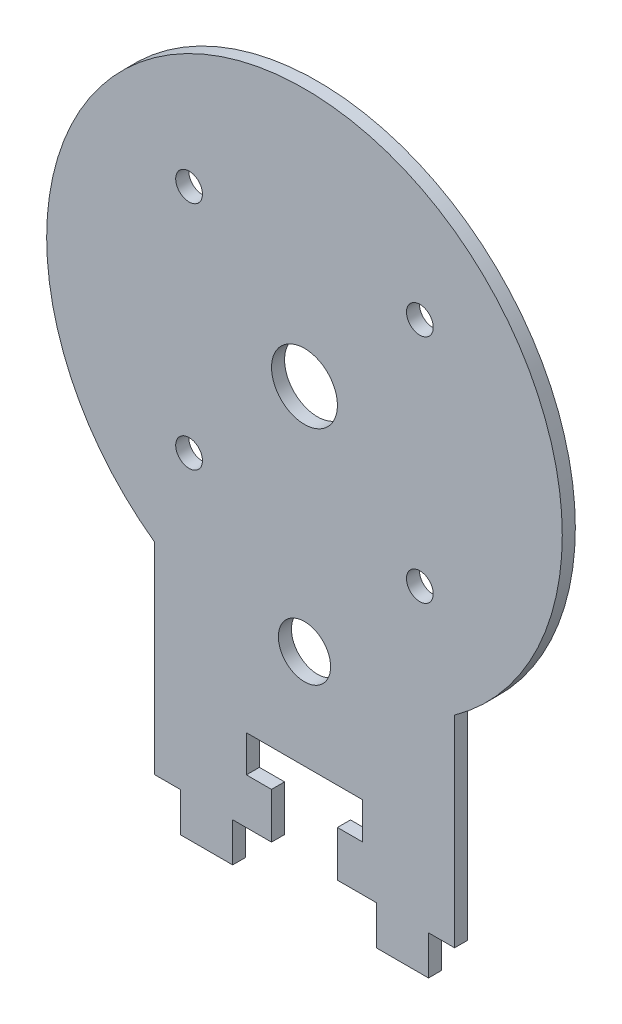
ISO-10303-21;
HEADER;
FILE_DESCRIPTION(('STEP AP214'),'2;1');
FILE_NAME('part.step','',(''),(''),'','','');
FILE_SCHEMA(('AUTOMOTIVE_DESIGN { 1 0 10303 214 1 1 1 1 }'));
ENDSEC;
DATA;
#1=APPLICATION_CONTEXT('core data for automotive mechanical design processes');
#2=APPLICATION_PROTOCOL_DEFINITION('international standard','automotive_design',2000,#1);
#3=PRODUCT_CONTEXT('',#1,'mechanical');
#4=PRODUCT('Part','Part','',(#3));
#5=PRODUCT_RELATED_PRODUCT_CATEGORY('part','',(#4));
#6=PRODUCT_DEFINITION_FORMATION('','',#4);
#7=PRODUCT_DEFINITION_CONTEXT('part definition',#1,'design');
#8=PRODUCT_DEFINITION('design','',#6,#7);
#9=PRODUCT_DEFINITION_SHAPE('','',#8);
#10=(LENGTH_UNIT() NAMED_UNIT(*) SI_UNIT(.MILLI.,.METRE.));
#11=(NAMED_UNIT(*) PLANE_ANGLE_UNIT() SI_UNIT($,.RADIAN.));
#12=(NAMED_UNIT(*) SI_UNIT($,.STERADIAN.) SOLID_ANGLE_UNIT());
#13=UNCERTAINTY_MEASURE_WITH_UNIT(LENGTH_MEASURE(1.E-05),#10,'distance_accuracy_value','');
#14=(GEOMETRIC_REPRESENTATION_CONTEXT(3) GLOBAL_UNCERTAINTY_ASSIGNED_CONTEXT((#13)) GLOBAL_UNIT_ASSIGNED_CONTEXT((#10,
#11,#12)) REPRESENTATION_CONTEXT('',''));
#15=CARTESIAN_POINT('',(0.,0.,0.));
#16=DIRECTION('',(0.,0.,1.));
#17=DIRECTION('',(1.,0.,0.));
#18=AXIS2_PLACEMENT_3D('',#15,#16,#17);
#19=CARTESIAN_POINT('',(-7.637732912881,83.7362785958988,2.));
#20=DIRECTION('',(0.,0.,-1.));
#21=DIRECTION('',(-1.,0.,0.));
#22=AXIS2_PLACEMENT_3D('',#19,#20,#21);
#23=PLANE('',#22);
#24=DIRECTION('',(1.,0.,0.));
#25=VECTOR('',#24,1.);
#26=CARTESIAN_POINT('',(-2.587732912881,20.7362785958988,2.));
#27=LINE('',#26,#25);
#28=CARTESIAN_POINT('',(-2.587732912881,20.7362785958988,2.));
#29=VERTEX_POINT('',#28);
#30=CARTESIAN_POINT('',(3.362267087119,20.7362785958988,2.));
#31=VERTEX_POINT('',#30);
#32=EDGE_CURVE('E244',#29,#31,#27,.T.);
#33=ORIENTED_EDGE('',*,*,#32,.T.);
#34=DIRECTION('',(0.,-1.,0.));
#35=VECTOR('',#34,1.);
#36=CARTESIAN_POINT('',(3.362267087119,20.7362785958988,2.));
#37=LINE('',#36,#35);
#38=CARTESIAN_POINT('',(3.362267087119,14.7362785958988,2.));
#39=VERTEX_POINT('',#38);
#40=EDGE_CURVE('E131',#31,#39,#37,.T.);
#41=ORIENTED_EDGE('',*,*,#40,.T.);
#42=DIRECTION('',(1.,0.,0.));
#43=VECTOR('',#42,1.);
#44=CARTESIAN_POINT('',(3.362267087119,14.7362785958988,2.));
#45=LINE('',#44,#43);
#46=CARTESIAN_POINT('',(11.362267087119,14.7362785958988,2.));
#47=VERTEX_POINT('',#46);
#48=EDGE_CURVE('E295',#39,#47,#45,.T.);
#49=ORIENTED_EDGE('',*,*,#48,.T.);
#50=DIRECTION('',(0.,1.,0.));
#51=VECTOR('',#50,1.);
#52=CARTESIAN_POINT('',(11.362267087119,14.7362785958988,2.));
#53=LINE('',#52,#51);
#54=CARTESIAN_POINT('',(11.362267087119,20.7362785958988,2.));
#55=VERTEX_POINT('',#54);
#56=EDGE_CURVE('E314',#47,#55,#53,.T.);
#57=ORIENTED_EDGE('',*,*,#56,.T.);
#58=DIRECTION('',(1.,0.,0.));
#59=VECTOR('',#58,1.);
#60=CARTESIAN_POINT('',(11.362267087119,20.7362785958988,2.));
#61=LINE('',#60,#59);
#62=CARTESIAN_POINT('',(15.362267087119,20.7362785958988,2.));
#63=VERTEX_POINT('',#62);
#64=EDGE_CURVE('E311',#55,#63,#61,.T.);
#65=ORIENTED_EDGE('',*,*,#64,.T.);
#66=DIRECTION('',(0.,1.,0.));
#67=VECTOR('',#66,1.);
#68=CARTESIAN_POINT('',(15.362267087119,20.7362785958988,2.));
#69=LINE('',#68,#67);
#70=CARTESIAN_POINT('',(15.362267087119,51.623197149236,2.));
#71=VERTEX_POINT('',#70);
#72=EDGE_CURVE('E313',#63,#71,#69,.T.);
#73=ORIENTED_EDGE('',*,*,#72,.T.);
#74=CARTESIAN_POINT('',(-7.637732912881,83.7362785958988,2.));
#75=DIRECTION('',(0.,0.,1.));
#76=DIRECTION('',(-1.,0.,0.));
#77=AXIS2_PLACEMENT_3D('',#74,#75,#76);
#78=CIRCLE('',#77,39.5);
#79=CARTESIAN_POINT('',(-30.637732912881,51.623197149236,2.));
#80=VERTEX_POINT('',#79);
#81=EDGE_CURVE('E316',#71,#80,#78,.T.);
#82=ORIENTED_EDGE('',*,*,#81,.T.);
#83=DIRECTION('',(0.,-1.,0.));
#84=VECTOR('',#83,1.);
#85=CARTESIAN_POINT('',(-30.637732912881,20.7362785958988,2.));
#86=LINE('',#85,#84);
#87=CARTESIAN_POINT('',(-30.637732912881,20.7362785958988,2.));
#88=VERTEX_POINT('',#87);
#89=EDGE_CURVE('E322',#80,#88,#86,.T.);
#90=ORIENTED_EDGE('',*,*,#89,.T.);
#91=DIRECTION('',(1.,0.,0.));
#92=VECTOR('',#91,1.);
#93=CARTESIAN_POINT('',(-26.637732912881,20.7362785958988,2.));
#94=LINE('',#93,#92);
#95=CARTESIAN_POINT('',(-26.637732912881,20.7362785958988,2.));
#96=VERTEX_POINT('',#95);
#97=EDGE_CURVE('E324',#88,#96,#94,.T.);
#98=ORIENTED_EDGE('',*,*,#97,.T.);
#99=DIRECTION('',(0.,-1.,0.));
#100=VECTOR('',#99,1.);
#101=CARTESIAN_POINT('',(-26.637732912881,14.7362785958988,2.));
#102=LINE('',#101,#100);
#103=CARTESIAN_POINT('',(-26.637732912881,14.7362785958988,2.));
#104=VERTEX_POINT('',#103);
#105=EDGE_CURVE('E326',#96,#104,#102,.T.);
#106=ORIENTED_EDGE('',*,*,#105,.T.);
#107=DIRECTION('',(1.,0.,0.));
#108=VECTOR('',#107,1.);
#109=CARTESIAN_POINT('',(-18.637732912881,14.7362785958988,2.));
#110=LINE('',#109,#108);
#111=CARTESIAN_POINT('',(-18.637732912881,14.7362785958988,2.));
#112=VERTEX_POINT('',#111);
#113=EDGE_CURVE('E328',#104,#112,#110,.T.);
#114=ORIENTED_EDGE('',*,*,#113,.T.);
#115=DIRECTION('',(0.,1.,0.));
#116=VECTOR('',#115,1.);
#117=CARTESIAN_POINT('',(-18.637732912881,20.7362785958988,2.));
#118=LINE('',#117,#116);
#119=CARTESIAN_POINT('',(-18.637732912881,20.7362785958988,2.));
#120=VERTEX_POINT('',#119);
#121=EDGE_CURVE('E330',#112,#120,#118,.T.);
#122=ORIENTED_EDGE('',*,*,#121,.T.);
#123=DIRECTION('',(1.,0.,0.));
#124=VECTOR('',#123,1.);
#125=CARTESIAN_POINT('',(-12.687732912881,20.7362785958988,2.));
#126=LINE('',#125,#124);
#127=CARTESIAN_POINT('',(-12.687732912881,20.7362785958988,2.));
#128=VERTEX_POINT('',#127);
#129=EDGE_CURVE('E332',#120,#128,#126,.T.);
#130=ORIENTED_EDGE('',*,*,#129,.T.);
#131=DIRECTION('',(0.,1.,0.));
#132=VECTOR('',#131,1.);
#133=CARTESIAN_POINT('',(-12.687732912881,20.7362785958988,2.));
#134=LINE('',#133,#132);
#135=CARTESIAN_POINT('',(-12.687732912881,27.7362785958988,2.));
#136=VERTEX_POINT('',#135);
#137=EDGE_CURVE('E334',#128,#136,#134,.T.);
#138=ORIENTED_EDGE('',*,*,#137,.T.);
#139=DIRECTION('',(-1.,0.,0.));
#140=VECTOR('',#139,1.);
#141=CARTESIAN_POINT('',(-12.687732912881,27.7362785958988,2.));
#142=LINE('',#141,#140);
#143=CARTESIAN_POINT('',(-16.537732912881,27.7362785958988,2.));
#144=VERTEX_POINT('',#143);
#145=EDGE_CURVE('E336',#136,#144,#142,.T.);
#146=ORIENTED_EDGE('',*,*,#145,.T.);
#147=DIRECTION('',(0.,1.,0.));
#148=VECTOR('',#147,1.);
#149=CARTESIAN_POINT('',(-16.537732912881,27.7362785958988,2.));
#150=LINE('',#149,#148);
#151=CARTESIAN_POINT('',(-16.537732912881,33.3362785958988,2.));
#152=VERTEX_POINT('',#151);
#153=EDGE_CURVE('E338',#144,#152,#150,.T.);
#154=ORIENTED_EDGE('',*,*,#153,.T.);
#155=DIRECTION('',(1.,0.,0.));
#156=VECTOR('',#155,1.);
#157=CARTESIAN_POINT('',(-16.537732912881,33.3362785958988,2.));
#158=LINE('',#157,#156);
#159=CARTESIAN_POINT('',(1.262267087119,33.3362785958988,2.));
#160=VERTEX_POINT('',#159);
#161=EDGE_CURVE('E186',#152,#160,#158,.T.);
#162=ORIENTED_EDGE('',*,*,#161,.T.);
#163=DIRECTION('',(0.,-1.,0.));
#164=VECTOR('',#163,1.);
#165=CARTESIAN_POINT('',(1.262267087119,27.7362785958988,2.));
#166=LINE('',#165,#164);
#167=CARTESIAN_POINT('',(1.262267087119,27.7362785958988,2.));
#168=VERTEX_POINT('',#167);
#169=EDGE_CURVE('E180',#160,#168,#166,.T.);
#170=ORIENTED_EDGE('',*,*,#169,.T.);
#171=DIRECTION('',(-1.,0.,0.));
#172=VECTOR('',#171,1.);
#173=CARTESIAN_POINT('',(-2.587732912881,27.7362785958988,2.));
#174=LINE('',#173,#172);
#175=CARTESIAN_POINT('',(-2.587732912881,27.7362785958988,2.));
#176=VERTEX_POINT('',#175);
#177=EDGE_CURVE('E184',#168,#176,#174,.T.);
#178=ORIENTED_EDGE('',*,*,#177,.T.);
#179=DIRECTION('',(0.,-1.,0.));
#180=VECTOR('',#179,1.);
#181=CARTESIAN_POINT('',(-2.587732912881,20.7362785958988,2.));
#182=LINE('',#181,#180);
#183=EDGE_CURVE('E52',#176,#29,#182,.T.);
#184=ORIENTED_EDGE('',*,*,#183,.T.);
#185=EDGE_LOOP('',(#33,#41,#49,#57,#65,#73,#82,#90,#98,#106,#114,#122,#130,#138,#146,#154,#162,
#170,#178,#184));
#186=FACE_BOUND('',#185,.T.);
#187=CARTESIAN_POINT('',(-7.637732912881,83.7362785958988,2.));
#188=DIRECTION('',(0.,0.,1.));
#189=DIRECTION('',(1.,0.,0.));
#190=AXIS2_PLACEMENT_3D('',#187,#188,#189);
#191=CIRCLE('',#190,5.05);
#192=CARTESIAN_POINT('',(-2.587732912881,83.7362785958988,2.));
#193=VERTEX_POINT('',#192);
#194=EDGE_CURVE('E208',#193,#193,#191,.T.);
#195=ORIENTED_EDGE('',*,*,#194,.F.);
#196=EDGE_LOOP('',(#195));
#197=FACE_BOUND('',#196,.T.);
#198=CARTESIAN_POINT('',(10.0399366167827,66.0586090662352,2.));
#199=DIRECTION('',(0.,0.,1.));
#200=DIRECTION('',(1.,0.,0.));
#201=AXIS2_PLACEMENT_3D('',#198,#199,#200);
#202=CIRCLE('',#201,2.05);
#203=CARTESIAN_POINT('',(12.0899366167827,66.0586090662352,2.));
#204=VERTEX_POINT('',#203);
#205=EDGE_CURVE('E421',#204,#204,#202,.T.);
#206=ORIENTED_EDGE('',*,*,#205,.F.);
#207=EDGE_LOOP('',(#206));
#208=FACE_BOUND('',#207,.T.);
#209=CARTESIAN_POINT('',(-7.637732912881,48.5362785958988,2.));
#210=DIRECTION('',(0.,0.,1.));
#211=DIRECTION('',(1.,0.,0.));
#212=AXIS2_PLACEMENT_3D('',#209,#210,#211);
#213=CIRCLE('',#212,4.);
#214=CARTESIAN_POINT('',(-3.637732912881,48.5362785958988,2.));
#215=VERTEX_POINT('',#214);
#216=EDGE_CURVE('E415',#215,#215,#213,.T.);
#217=ORIENTED_EDGE('',*,*,#216,.F.);
#218=EDGE_LOOP('',(#217));
#219=FACE_BOUND('',#218,.T.);
#220=CARTESIAN_POINT('',(-25.3154024425446,66.0586090662351,2.));
#221=DIRECTION('',(0.,0.,1.));
#222=DIRECTION('',(1.,0.,0.));
#223=AXIS2_PLACEMENT_3D('',#220,#221,#222);
#224=CIRCLE('',#223,2.04999999999999);
#225=CARTESIAN_POINT('',(-23.2654024425446,66.0586090662351,2.));
#226=VERTEX_POINT('',#225);
#227=EDGE_CURVE('E409',#226,#226,#224,.T.);
#228=ORIENTED_EDGE('',*,*,#227,.F.);
#229=EDGE_LOOP('',(#228));
#230=FACE_BOUND('',#229,.T.);
#231=CARTESIAN_POINT('',(-25.3154024425447,101.413948125562,2.));
#232=DIRECTION('',(0.,0.,1.));
#233=DIRECTION('',(1.,0.,0.));
#234=AXIS2_PLACEMENT_3D('',#231,#232,#233);
#235=CIRCLE('',#234,2.04999999999999);
#236=CARTESIAN_POINT('',(-23.2654024425447,101.413948125562,2.));
#237=VERTEX_POINT('',#236);
#238=EDGE_CURVE('E403',#237,#237,#235,.T.);
#239=ORIENTED_EDGE('',*,*,#238,.F.);
#240=EDGE_LOOP('',(#239));
#241=FACE_BOUND('',#240,.T.);
#242=CARTESIAN_POINT('',(10.0399366167827,101.413948125563,2.));
#243=DIRECTION('',(0.,0.,1.));
#244=DIRECTION('',(1.,0.,0.));
#245=AXIS2_PLACEMENT_3D('',#242,#243,#244);
#246=CIRCLE('',#245,2.04999999999999);
#247=CARTESIAN_POINT('',(12.0899366167827,101.413948125563,2.));
#248=VERTEX_POINT('',#247);
#249=EDGE_CURVE('E394',#248,#248,#246,.T.);
#250=ORIENTED_EDGE('',*,*,#249,.F.);
#251=EDGE_LOOP('',(#250));
#252=FACE_BOUND('',#251,.T.);
#253=ADVANCED_FACE('F35',(#186,#197,#208,#219,#230,#241,#252),#23,.F.);
#254=CARTESIAN_POINT('',(-7.637732912881,83.7362785958988,0.));
#255=DIRECTION('',(0.,0.,-1.));
#256=DIRECTION('',(-1.,0.,0.));
#257=AXIS2_PLACEMENT_3D('',#254,#255,#256);
#258=PLANE('',#257);
#259=CARTESIAN_POINT('',(-25.3154024425447,101.413948125562,0.));
#260=DIRECTION('',(0.,0.,1.));
#261=DIRECTION('',(1.,0.,0.));
#262=AXIS2_PLACEMENT_3D('',#259,#260,#261);
#263=CIRCLE('',#262,2.04999999999999);
#264=CARTESIAN_POINT('',(-23.2654024425447,101.413948125562,0.));
#265=VERTEX_POINT('',#264);
#266=EDGE_CURVE('E400',#265,#265,#263,.T.);
#267=ORIENTED_EDGE('',*,*,#266,.T.);
#268=EDGE_LOOP('',(#267));
#269=FACE_BOUND('',#268,.T.);
#270=CARTESIAN_POINT('',(-7.637732912881,48.5362785958988,0.));
#271=DIRECTION('',(0.,0.,1.));
#272=DIRECTION('',(1.,0.,0.));
#273=AXIS2_PLACEMENT_3D('',#270,#271,#272);
#274=CIRCLE('',#273,4.);
#275=CARTESIAN_POINT('',(-3.637732912881,48.5362785958988,0.));
#276=VERTEX_POINT('',#275);
#277=EDGE_CURVE('E412',#276,#276,#274,.T.);
#278=ORIENTED_EDGE('',*,*,#277,.T.);
#279=EDGE_LOOP('',(#278));
#280=FACE_BOUND('',#279,.T.);
#281=CARTESIAN_POINT('',(-7.637732912881,83.7362785958988,0.));
#282=DIRECTION('',(0.,0.,1.));
#283=DIRECTION('',(1.,0.,0.));
#284=AXIS2_PLACEMENT_3D('',#281,#282,#283);
#285=CIRCLE('',#284,5.05);
#286=CARTESIAN_POINT('',(-2.587732912881,83.7362785958988,0.));
#287=VERTEX_POINT('',#286);
#288=EDGE_CURVE('E424',#287,#287,#285,.T.);
#289=ORIENTED_EDGE('',*,*,#288,.T.);
#290=EDGE_LOOP('',(#289));
#291=FACE_BOUND('',#290,.T.);
#292=DIRECTION('',(1.,0.,0.));
#293=VECTOR('',#292,1.);
#294=CARTESIAN_POINT('',(-2.587732912881,20.7362785958988,0.));
#295=LINE('',#294,#293);
#296=CARTESIAN_POINT('',(-2.587732912881,20.7362785958988,0.));
#297=VERTEX_POINT('',#296);
#298=CARTESIAN_POINT('',(3.362267087119,20.7362785958988,0.));
#299=VERTEX_POINT('',#298);
#300=EDGE_CURVE('E204',#297,#299,#295,.T.);
#301=ORIENTED_EDGE('',*,*,#300,.F.);
#302=DIRECTION('',(0.,-1.,0.));
#303=VECTOR('',#302,1.);
#304=CARTESIAN_POINT('',(-2.587732912881,20.7362785958988,0.));
#305=LINE('',#304,#303);
#306=CARTESIAN_POINT('',(-2.587732912881,27.7362785958988,0.));
#307=VERTEX_POINT('',#306);
#308=EDGE_CURVE('E123',#307,#297,#305,.T.);
#309=ORIENTED_EDGE('',*,*,#308,.F.);
#310=DIRECTION('',(-1.,0.,0.));
#311=VECTOR('',#310,1.);
#312=CARTESIAN_POINT('',(-2.587732912881,27.7362785958988,0.));
#313=LINE('',#312,#311);
#314=CARTESIAN_POINT('',(1.262267087119,27.7362785958988,0.));
#315=VERTEX_POINT('',#314);
#316=EDGE_CURVE('E117',#315,#307,#313,.T.);
#317=ORIENTED_EDGE('',*,*,#316,.F.);
#318=DIRECTION('',(0.,-1.,0.));
#319=VECTOR('',#318,1.);
#320=CARTESIAN_POINT('',(1.262267087119,27.7362785958988,0.));
#321=LINE('',#320,#319);
#322=CARTESIAN_POINT('',(1.262267087119,33.3362785958988,0.));
#323=VERTEX_POINT('',#322);
#324=EDGE_CURVE('E194',#323,#315,#321,.T.);
#325=ORIENTED_EDGE('',*,*,#324,.F.);
#326=DIRECTION('',(1.,0.,0.));
#327=VECTOR('',#326,1.);
#328=CARTESIAN_POINT('',(1.262267087119,33.3362785958988,0.));
#329=LINE('',#328,#327);
#330=CARTESIAN_POINT('',(-16.537732912881,33.3362785958988,0.));
#331=VERTEX_POINT('',#330);
#332=EDGE_CURVE('E239',#331,#323,#329,.T.);
#333=ORIENTED_EDGE('',*,*,#332,.F.);
#334=DIRECTION('',(0.,1.,0.));
#335=VECTOR('',#334,1.);
#336=CARTESIAN_POINT('',(-16.537732912881,27.7362785958988,0.));
#337=LINE('',#336,#335);
#338=CARTESIAN_POINT('',(-16.537732912881,27.7362785958988,0.));
#339=VERTEX_POINT('',#338);
#340=EDGE_CURVE('E236',#339,#331,#337,.T.);
#341=ORIENTED_EDGE('',*,*,#340,.F.);
#342=DIRECTION('',(-1.,0.,0.));
#343=VECTOR('',#342,1.);
#344=CARTESIAN_POINT('',(-12.687732912881,27.7362785958988,0.));
#345=LINE('',#344,#343);
#346=CARTESIAN_POINT('',(-12.687732912881,27.7362785958988,0.));
#347=VERTEX_POINT('',#346);
#348=EDGE_CURVE('E234',#347,#339,#345,.T.);
#349=ORIENTED_EDGE('',*,*,#348,.F.);
#350=DIRECTION('',(0.,1.,0.));
#351=VECTOR('',#350,1.);
#352=CARTESIAN_POINT('',(-12.687732912881,20.7362785958988,0.));
#353=LINE('',#352,#351);
#354=CARTESIAN_POINT('',(-12.687732912881,20.7362785958988,0.));
#355=VERTEX_POINT('',#354);
#356=EDGE_CURVE('E232',#355,#347,#353,.T.);
#357=ORIENTED_EDGE('',*,*,#356,.F.);
#358=DIRECTION('',(1.,0.,0.));
#359=VECTOR('',#358,1.);
#360=CARTESIAN_POINT('',(-12.687732912881,20.7362785958988,0.));
#361=LINE('',#360,#359);
#362=CARTESIAN_POINT('',(-18.637732912881,20.7362785958988,0.));
#363=VERTEX_POINT('',#362);
#364=EDGE_CURVE('E230',#363,#355,#361,.T.);
#365=ORIENTED_EDGE('',*,*,#364,.F.);
#366=DIRECTION('',(0.,1.,0.));
#367=VECTOR('',#366,1.);
#368=CARTESIAN_POINT('',(-18.637732912881,20.7362785958988,0.));
#369=LINE('',#368,#367);
#370=CARTESIAN_POINT('',(-18.637732912881,14.7362785958988,0.));
#371=VERTEX_POINT('',#370);
#372=EDGE_CURVE('E228',#371,#363,#369,.T.);
#373=ORIENTED_EDGE('',*,*,#372,.F.);
#374=DIRECTION('',(1.,0.,0.));
#375=VECTOR('',#374,1.);
#376=CARTESIAN_POINT('',(-18.637732912881,14.7362785958988,0.));
#377=LINE('',#376,#375);
#378=CARTESIAN_POINT('',(-26.637732912881,14.7362785958988,0.));
#379=VERTEX_POINT('',#378);
#380=EDGE_CURVE('E226',#379,#371,#377,.T.);
#381=ORIENTED_EDGE('',*,*,#380,.F.);
#382=DIRECTION('',(0.,-1.,0.));
#383=VECTOR('',#382,1.);
#384=CARTESIAN_POINT('',(-26.637732912881,14.7362785958988,0.));
#385=LINE('',#384,#383);
#386=CARTESIAN_POINT('',(-26.637732912881,20.7362785958988,0.));
#387=VERTEX_POINT('',#386);
#388=EDGE_CURVE('E224',#387,#379,#385,.T.);
#389=ORIENTED_EDGE('',*,*,#388,.F.);
#390=DIRECTION('',(1.,0.,0.));
#391=VECTOR('',#390,1.);
#392=CARTESIAN_POINT('',(-26.637732912881,20.7362785958988,0.));
#393=LINE('',#392,#391);
#394=CARTESIAN_POINT('',(-30.637732912881,20.7362785958988,0.));
#395=VERTEX_POINT('',#394);
#396=EDGE_CURVE('E222',#395,#387,#393,.T.);
#397=ORIENTED_EDGE('',*,*,#396,.F.);
#398=DIRECTION('',(0.,-1.,0.));
#399=VECTOR('',#398,1.);
#400=CARTESIAN_POINT('',(-30.637732912881,20.7362785958988,0.));
#401=LINE('',#400,#399);
#402=CARTESIAN_POINT('',(-30.637732912881,51.623197149236,0.));
#403=VERTEX_POINT('',#402);
#404=EDGE_CURVE('E220',#403,#395,#401,.T.);
#405=ORIENTED_EDGE('',*,*,#404,.F.);
#406=CARTESIAN_POINT('',(-7.637732912881,83.7362785958988,0.));
#407=DIRECTION('',(0.,0.,1.));
#408=DIRECTION('',(-1.,0.,0.));
#409=AXIS2_PLACEMENT_3D('',#406,#407,#408);
#410=CIRCLE('',#409,39.5);
#411=CARTESIAN_POINT('',(15.362267087119,51.623197149236,0.));
#412=VERTEX_POINT('',#411);
#413=EDGE_CURVE('E218',#412,#403,#410,.T.);
#414=ORIENTED_EDGE('',*,*,#413,.F.);
#415=DIRECTION('',(0.,1.,0.));
#416=VECTOR('',#415,1.);
#417=CARTESIAN_POINT('',(15.362267087119,20.7362785958988,0.));
#418=LINE('',#417,#416);
#419=CARTESIAN_POINT('',(15.362267087119,20.7362785958988,0.));
#420=VERTEX_POINT('',#419);
#421=EDGE_CURVE('E216',#420,#412,#418,.T.);
#422=ORIENTED_EDGE('',*,*,#421,.F.);
#423=DIRECTION('',(1.,0.,0.));
#424=VECTOR('',#423,1.);
#425=CARTESIAN_POINT('',(11.362267087119,20.7362785958988,0.));
#426=LINE('',#425,#424);
#427=CARTESIAN_POINT('',(11.362267087119,20.7362785958988,0.));
#428=VERTEX_POINT('',#427);
#429=EDGE_CURVE('E214',#428,#420,#426,.T.);
#430=ORIENTED_EDGE('',*,*,#429,.F.);
#431=DIRECTION('',(0.,1.,0.));
#432=VECTOR('',#431,1.);
#433=CARTESIAN_POINT('',(11.362267087119,14.7362785958988,0.));
#434=LINE('',#433,#432);
#435=CARTESIAN_POINT('',(11.362267087119,14.7362785958988,0.));
#436=VERTEX_POINT('',#435);
#437=EDGE_CURVE('E212',#436,#428,#434,.T.);
#438=ORIENTED_EDGE('',*,*,#437,.F.);
#439=DIRECTION('',(1.,0.,0.));
#440=VECTOR('',#439,1.);
#441=CARTESIAN_POINT('',(3.362267087119,14.7362785958988,0.));
#442=LINE('',#441,#440);
#443=CARTESIAN_POINT('',(3.362267087119,14.7362785958988,0.));
#444=VERTEX_POINT('',#443);
#445=EDGE_CURVE('E210',#444,#436,#442,.T.);
#446=ORIENTED_EDGE('',*,*,#445,.F.);
#447=DIRECTION('',(0.,-1.,0.));
#448=VECTOR('',#447,1.);
#449=CARTESIAN_POINT('',(3.362267087119,20.7362785958988,0.));
#450=LINE('',#449,#448);
#451=EDGE_CURVE('E207',#299,#444,#450,.T.);
#452=ORIENTED_EDGE('',*,*,#451,.F.);
#453=EDGE_LOOP('',(#301,#309,#317,#325,#333,#341,#349,#357,#365,#373,#381,#389,#397,#405,#414,
#422,#430,#438,#446,#452));
#454=FACE_BOUND('',#453,.T.);
#455=CARTESIAN_POINT('',(10.0399366167827,66.0586090662352,0.));
#456=DIRECTION('',(0.,0.,1.));
#457=DIRECTION('',(1.,0.,0.));
#458=AXIS2_PLACEMENT_3D('',#455,#456,#457);
#459=CIRCLE('',#458,2.05);
#460=CARTESIAN_POINT('',(12.0899366167827,66.0586090662352,0.));
#461=VERTEX_POINT('',#460);
#462=EDGE_CURVE('E418',#461,#461,#459,.T.);
#463=ORIENTED_EDGE('',*,*,#462,.T.);
#464=EDGE_LOOP('',(#463));
#465=FACE_BOUND('',#464,.T.);
#466=CARTESIAN_POINT('',(-25.3154024425446,66.0586090662351,0.));
#467=DIRECTION('',(0.,0.,1.));
#468=DIRECTION('',(1.,0.,0.));
#469=AXIS2_PLACEMENT_3D('',#466,#467,#468);
#470=CIRCLE('',#469,2.04999999999999);
#471=CARTESIAN_POINT('',(-23.2654024425446,66.0586090662351,0.));
#472=VERTEX_POINT('',#471);
#473=EDGE_CURVE('E406',#472,#472,#470,.T.);
#474=ORIENTED_EDGE('',*,*,#473,.T.);
#475=EDGE_LOOP('',(#474));
#476=FACE_BOUND('',#475,.T.);
#477=CARTESIAN_POINT('',(10.0399366167827,101.413948125563,0.));
#478=DIRECTION('',(0.,0.,1.));
#479=DIRECTION('',(1.,0.,0.));
#480=AXIS2_PLACEMENT_3D('',#477,#478,#479);
#481=CIRCLE('',#480,2.04999999999999);
#482=CARTESIAN_POINT('',(12.0899366167827,101.413948125563,0.));
#483=VERTEX_POINT('',#482);
#484=EDGE_CURVE('E397',#483,#483,#481,.T.);
#485=ORIENTED_EDGE('',*,*,#484,.T.);
#486=EDGE_LOOP('',(#485));
#487=FACE_BOUND('',#486,.T.);
#488=ADVANCED_FACE('F299',(#269,#280,#291,#454,#465,#476,#487),#258,.T.);
#489=CARTESIAN_POINT('',(-2.587732912881,20.7362785958988,2.));
#490=DIRECTION('',(0.,1.,0.));
#491=DIRECTION('',(0.,0.,1.));
#492=AXIS2_PLACEMENT_3D('',#489,#490,#491);
#493=PLANE('',#492);
#494=ORIENTED_EDGE('',*,*,#300,.T.);
#495=DIRECTION('',(0.,0.,-1.));
#496=VECTOR('',#495,1.);
#497=CARTESIAN_POINT('',(3.362267087119,20.7362785958988,2.));
#498=LINE('',#497,#496);
#499=EDGE_CURVE('E11',#31,#299,#498,.T.);
#500=ORIENTED_EDGE('',*,*,#499,.F.);
#501=ORIENTED_EDGE('',*,*,#32,.F.);
#502=DIRECTION('',(0.,0.,-1.));
#503=VECTOR('',#502,1.);
#504=CARTESIAN_POINT('',(-2.587732912881,20.7362785958988,2.));
#505=LINE('',#504,#503);
#506=EDGE_CURVE('E200',#29,#297,#505,.T.);
#507=ORIENTED_EDGE('',*,*,#506,.T.);
#508=EDGE_LOOP('',(#494,#500,#501,#507));
#509=FACE_BOUND('',#508,.T.);
#510=ADVANCED_FACE('F37',(#509),#493,.F.);
#511=CARTESIAN_POINT('',(3.362267087119,20.7362785958988,2.));
#512=DIRECTION('',(1.,0.,0.));
#513=DIRECTION('',(0.,1.,0.));
#514=AXIS2_PLACEMENT_3D('',#511,#512,#513);
#515=PLANE('',#514);
#516=ORIENTED_EDGE('',*,*,#451,.T.);
#517=DIRECTION('',(0.,0.,-1.));
#518=VECTOR('',#517,1.);
#519=CARTESIAN_POINT('',(3.362267087119,14.7362785958988,2.));
#520=LINE('',#519,#518);
#521=EDGE_CURVE('E44',#39,#444,#520,.T.);
#522=ORIENTED_EDGE('',*,*,#521,.F.);
#523=ORIENTED_EDGE('',*,*,#40,.F.);
#524=ORIENTED_EDGE('',*,*,#499,.T.);
#525=EDGE_LOOP('',(#516,#522,#523,#524));
#526=FACE_BOUND('',#525,.T.);
#527=ADVANCED_FACE('F636',(#526),#515,.F.);
#528=CARTESIAN_POINT('',(3.362267087119,14.7362785958988,2.));
#529=DIRECTION('',(0.,1.,0.));
#530=DIRECTION('',(0.,0.,1.));
#531=AXIS2_PLACEMENT_3D('',#528,#529,#530);
#532=PLANE('',#531);
#533=ORIENTED_EDGE('',*,*,#445,.T.);
#534=DIRECTION('',(0.,0.,-1.));
#535=VECTOR('',#534,1.);
#536=CARTESIAN_POINT('',(11.362267087119,14.7362785958988,2.));
#537=LINE('',#536,#535);
#538=EDGE_CURVE('E287',#47,#436,#537,.T.);
#539=ORIENTED_EDGE('',*,*,#538,.F.);
#540=ORIENTED_EDGE('',*,*,#48,.F.);
#541=ORIENTED_EDGE('',*,*,#521,.T.);
#542=EDGE_LOOP('',(#533,#539,#540,#541));
#543=FACE_BOUND('',#542,.T.);
#544=ADVANCED_FACE('F293',(#543),#532,.F.);
#545=CARTESIAN_POINT('',(11.362267087119,14.7362785958988,2.));
#546=DIRECTION('',(-1.,0.,0.));
#547=DIRECTION('',(0.,-1.,0.));
#548=AXIS2_PLACEMENT_3D('',#545,#546,#547);
#549=PLANE('',#548);
#550=ORIENTED_EDGE('',*,*,#437,.T.);
#551=DIRECTION('',(0.,0.,-1.));
#552=VECTOR('',#551,1.);
#553=CARTESIAN_POINT('',(11.362267087119,20.7362785958988,2.));
#554=LINE('',#553,#552);
#555=EDGE_CURVE('E284',#55,#428,#554,.T.);
#556=ORIENTED_EDGE('',*,*,#555,.F.);
#557=ORIENTED_EDGE('',*,*,#56,.F.);
#558=ORIENTED_EDGE('',*,*,#538,.T.);
#559=EDGE_LOOP('',(#550,#556,#557,#558));
#560=FACE_BOUND('',#559,.T.);
#561=ADVANCED_FACE('F305',(#560),#549,.F.);
#562=CARTESIAN_POINT('',(11.362267087119,20.7362785958988,2.));
#563=DIRECTION('',(0.,1.,0.));
#564=DIRECTION('',(-1.,0.,0.));
#565=AXIS2_PLACEMENT_3D('',#562,#563,#564);
#566=PLANE('',#565);
#567=ORIENTED_EDGE('',*,*,#429,.T.);
#568=DIRECTION('',(0.,0.,-1.));
#569=VECTOR('',#568,1.);
#570=CARTESIAN_POINT('',(15.362267087119,20.7362785958988,2.));
#571=LINE('',#570,#569);
#572=EDGE_CURVE('E281',#63,#420,#571,.T.);
#573=ORIENTED_EDGE('',*,*,#572,.F.);
#574=ORIENTED_EDGE('',*,*,#64,.F.);
#575=ORIENTED_EDGE('',*,*,#555,.T.);
#576=EDGE_LOOP('',(#567,#573,#574,#575));
#577=FACE_BOUND('',#576,.T.);
#578=ADVANCED_FACE('F309',(#577),#566,.F.);
#579=CARTESIAN_POINT('',(15.362267087119,20.7362785958988,2.));
#580=DIRECTION('',(-1.,0.,0.));
#581=DIRECTION('',(0.,-1.,0.));
#582=AXIS2_PLACEMENT_3D('',#579,#580,#581);
#583=PLANE('',#582);
#584=ORIENTED_EDGE('',*,*,#421,.T.);
#585=DIRECTION('',(0.,0.,-1.));
#586=VECTOR('',#585,1.);
#587=CARTESIAN_POINT('',(15.362267087119,51.623197149236,2.));
#588=LINE('',#587,#586);
#589=EDGE_CURVE('E278',#71,#412,#588,.T.);
#590=ORIENTED_EDGE('',*,*,#589,.F.);
#591=ORIENTED_EDGE('',*,*,#72,.F.);
#592=ORIENTED_EDGE('',*,*,#572,.T.);
#593=EDGE_LOOP('',(#584,#590,#591,#592));
#594=FACE_BOUND('',#593,.T.);
#595=ADVANCED_FACE('F601',(#594),#583,.F.);
#596=CARTESIAN_POINT('',(-7.637732912881,83.7362785958988,2.));
#597=DIRECTION('',(0.,0.,-1.));
#598=DIRECTION('',(-1.,0.,0.));
#599=AXIS2_PLACEMENT_3D('',#596,#597,#598);
#600=CYLINDRICAL_SURFACE('',#599,39.5);
#601=ORIENTED_EDGE('',*,*,#413,.T.);
#602=DIRECTION('',(0.,0.,-1.));
#603=VECTOR('',#602,1.);
#604=CARTESIAN_POINT('',(-30.637732912881,51.623197149236,2.));
#605=LINE('',#604,#603);
#606=EDGE_CURVE('E275',#80,#403,#605,.T.);
#607=ORIENTED_EDGE('',*,*,#606,.F.);
#608=ORIENTED_EDGE('',*,*,#81,.F.);
#609=ORIENTED_EDGE('',*,*,#589,.T.);
#610=EDGE_LOOP('',(#601,#607,#608,#609));
#611=FACE_BOUND('',#610,.T.);
#612=ADVANCED_FACE('F591',(#611),#600,.T.);
#613=CARTESIAN_POINT('',(-30.637732912881,20.7362785958988,2.));
#614=DIRECTION('',(1.,0.,0.));
#615=DIRECTION('',(0.,0.,-1.));
#616=AXIS2_PLACEMENT_3D('',#613,#614,#615);
#617=PLANE('',#616);
#618=ORIENTED_EDGE('',*,*,#404,.T.);
#619=DIRECTION('',(0.,0.,-1.));
#620=VECTOR('',#619,1.);
#621=CARTESIAN_POINT('',(-30.637732912881,20.7362785958988,2.));
#622=LINE('',#621,#620);
#623=EDGE_CURVE('E272',#88,#395,#622,.T.);
#624=ORIENTED_EDGE('',*,*,#623,.F.);
#625=ORIENTED_EDGE('',*,*,#89,.F.);
#626=ORIENTED_EDGE('',*,*,#606,.T.);
#627=EDGE_LOOP('',(#618,#624,#625,#626));
#628=FACE_BOUND('',#627,.T.);
#629=ADVANCED_FACE('F581',(#628),#617,.F.);
#630=CARTESIAN_POINT('',(-26.637732912881,20.7362785958988,2.));
#631=DIRECTION('',(0.,1.,0.));
#632=DIRECTION('',(-1.,0.,0.));
#633=AXIS2_PLACEMENT_3D('',#630,#631,#632);
#634=PLANE('',#633);
#635=ORIENTED_EDGE('',*,*,#396,.T.);
#636=DIRECTION('',(0.,0.,-1.));
#637=VECTOR('',#636,1.);
#638=CARTESIAN_POINT('',(-26.637732912881,20.7362785958988,2.));
#639=LINE('',#638,#637);
#640=EDGE_CURVE('E269',#96,#387,#639,.T.);
#641=ORIENTED_EDGE('',*,*,#640,.F.);
#642=ORIENTED_EDGE('',*,*,#97,.F.);
#643=ORIENTED_EDGE('',*,*,#623,.T.);
#644=EDGE_LOOP('',(#635,#641,#642,#643));
#645=FACE_BOUND('',#644,.T.);
#646=ADVANCED_FACE('F571',(#645),#634,.F.);
#647=CARTESIAN_POINT('',(-26.637732912881,14.7362785958988,2.));
#648=DIRECTION('',(1.,0.,0.));
#649=DIRECTION('',(0.,0.,-1.));
#650=AXIS2_PLACEMENT_3D('',#647,#648,#649);
#651=PLANE('',#650);
#652=ORIENTED_EDGE('',*,*,#388,.T.);
#653=DIRECTION('',(0.,0.,-1.));
#654=VECTOR('',#653,1.);
#655=CARTESIAN_POINT('',(-26.637732912881,14.7362785958988,2.));
#656=LINE('',#655,#654);
#657=EDGE_CURVE('E266',#104,#379,#656,.T.);
#658=ORIENTED_EDGE('',*,*,#657,.F.);
#659=ORIENTED_EDGE('',*,*,#105,.F.);
#660=ORIENTED_EDGE('',*,*,#640,.T.);
#661=EDGE_LOOP('',(#652,#658,#659,#660));
#662=FACE_BOUND('',#661,.T.);
#663=ADVANCED_FACE('F561',(#662),#651,.F.);
#664=CARTESIAN_POINT('',(-18.637732912881,14.7362785958988,2.));
#665=DIRECTION('',(0.,1.,0.));
#666=DIRECTION('',(0.,0.,1.));
#667=AXIS2_PLACEMENT_3D('',#664,#665,#666);
#668=PLANE('',#667);
#669=ORIENTED_EDGE('',*,*,#380,.T.);
#670=DIRECTION('',(0.,0.,-1.));
#671=VECTOR('',#670,1.);
#672=CARTESIAN_POINT('',(-18.637732912881,14.7362785958988,2.));
#673=LINE('',#672,#671);
#674=EDGE_CURVE('E263',#112,#371,#673,.T.);
#675=ORIENTED_EDGE('',*,*,#674,.F.);
#676=ORIENTED_EDGE('',*,*,#113,.F.);
#677=ORIENTED_EDGE('',*,*,#657,.T.);
#678=EDGE_LOOP('',(#669,#675,#676,#677));
#679=FACE_BOUND('',#678,.T.);
#680=ADVANCED_FACE('F551',(#679),#668,.F.);
#681=CARTESIAN_POINT('',(-18.637732912881,20.7362785958988,2.));
#682=DIRECTION('',(-1.,0.,0.));
#683=DIRECTION('',(0.,-1.,0.));
#684=AXIS2_PLACEMENT_3D('',#681,#682,#683);
#685=PLANE('',#684);
#686=ORIENTED_EDGE('',*,*,#372,.T.);
#687=DIRECTION('',(0.,0.,-1.));
#688=VECTOR('',#687,1.);
#689=CARTESIAN_POINT('',(-18.637732912881,20.7362785958988,2.));
#690=LINE('',#689,#688);
#691=EDGE_CURVE('E260',#120,#363,#690,.T.);
#692=ORIENTED_EDGE('',*,*,#691,.F.);
#693=ORIENTED_EDGE('',*,*,#121,.F.);
#694=ORIENTED_EDGE('',*,*,#674,.T.);
#695=EDGE_LOOP('',(#686,#692,#693,#694));
#696=FACE_BOUND('',#695,.T.);
#697=ADVANCED_FACE('F541',(#696),#685,.F.);
#698=CARTESIAN_POINT('',(-12.687732912881,20.7362785958988,2.));
#699=DIRECTION('',(0.,1.,0.));
#700=DIRECTION('',(0.,0.,1.));
#701=AXIS2_PLACEMENT_3D('',#698,#699,#700);
#702=PLANE('',#701);
#703=ORIENTED_EDGE('',*,*,#364,.T.);
#704=DIRECTION('',(0.,0.,-1.));
#705=VECTOR('',#704,1.);
#706=CARTESIAN_POINT('',(-12.687732912881,20.7362785958988,2.));
#707=LINE('',#706,#705);
#708=EDGE_CURVE('E257',#128,#355,#707,.T.);
#709=ORIENTED_EDGE('',*,*,#708,.F.);
#710=ORIENTED_EDGE('',*,*,#129,.F.);
#711=ORIENTED_EDGE('',*,*,#691,.T.);
#712=EDGE_LOOP('',(#703,#709,#710,#711));
#713=FACE_BOUND('',#712,.T.);
#714=ADVANCED_FACE('F531',(#713),#702,.F.);
#715=CARTESIAN_POINT('',(-12.687732912881,20.7362785958988,2.));
#716=DIRECTION('',(-1.,0.,0.));
#717=DIRECTION('',(0.,0.,1.));
#718=AXIS2_PLACEMENT_3D('',#715,#716,#717);
#719=PLANE('',#718);
#720=ORIENTED_EDGE('',*,*,#356,.T.);
#721=DIRECTION('',(0.,0.,-1.));
#722=VECTOR('',#721,1.);
#723=CARTESIAN_POINT('',(-12.687732912881,27.7362785958988,2.));
#724=LINE('',#723,#722);
#725=EDGE_CURVE('E254',#136,#347,#724,.T.);
#726=ORIENTED_EDGE('',*,*,#725,.F.);
#727=ORIENTED_EDGE('',*,*,#137,.F.);
#728=ORIENTED_EDGE('',*,*,#708,.T.);
#729=EDGE_LOOP('',(#720,#726,#727,#728));
#730=FACE_BOUND('',#729,.T.);
#731=ADVANCED_FACE('F521',(#730),#719,.F.);
#732=CARTESIAN_POINT('',(-12.687732912881,27.7362785958988,2.));
#733=DIRECTION('',(0.,-1.,0.));
#734=DIRECTION('',(0.,0.,-1.));
#735=AXIS2_PLACEMENT_3D('',#732,#733,#734);
#736=PLANE('',#735);
#737=ORIENTED_EDGE('',*,*,#348,.T.);
#738=DIRECTION('',(0.,0.,-1.));
#739=VECTOR('',#738,1.);
#740=CARTESIAN_POINT('',(-16.537732912881,27.7362785958988,2.));
#741=LINE('',#740,#739);
#742=EDGE_CURVE('E251',#144,#339,#741,.T.);
#743=ORIENTED_EDGE('',*,*,#742,.F.);
#744=ORIENTED_EDGE('',*,*,#145,.F.);
#745=ORIENTED_EDGE('',*,*,#725,.T.);
#746=EDGE_LOOP('',(#737,#743,#744,#745));
#747=FACE_BOUND('',#746,.T.);
#748=ADVANCED_FACE('F511',(#747),#736,.F.);
#749=CARTESIAN_POINT('',(-16.537732912881,27.7362785958988,2.));
#750=DIRECTION('',(-1.,0.,0.));
#751=DIRECTION('',(0.,0.,1.));
#752=AXIS2_PLACEMENT_3D('',#749,#750,#751);
#753=PLANE('',#752);
#754=ORIENTED_EDGE('',*,*,#340,.T.);
#755=DIRECTION('',(0.,0.,-1.));
#756=VECTOR('',#755,1.);
#757=CARTESIAN_POINT('',(-16.537732912881,33.3362785958988,2.));
#758=LINE('',#757,#756);
#759=EDGE_CURVE('E248',#152,#331,#758,.T.);
#760=ORIENTED_EDGE('',*,*,#759,.F.);
#761=ORIENTED_EDGE('',*,*,#153,.F.);
#762=ORIENTED_EDGE('',*,*,#742,.T.);
#763=EDGE_LOOP('',(#754,#760,#761,#762));
#764=FACE_BOUND('',#763,.T.);
#765=ADVANCED_FACE('F344',(#764),#753,.F.);
#766=CARTESIAN_POINT('',(1.262267087119,33.3362785958988,2.));
#767=DIRECTION('',(0.,1.,0.));
#768=DIRECTION('',(0.,0.,1.));
#769=AXIS2_PLACEMENT_3D('',#766,#767,#768);
#770=PLANE('',#769);
#771=ORIENTED_EDGE('',*,*,#332,.T.);
#772=DIRECTION('',(0.,0.,-1.));
#773=VECTOR('',#772,1.);
#774=CARTESIAN_POINT('',(1.262267087119,33.3362785958988,2.));
#775=LINE('',#774,#773);
#776=EDGE_CURVE('E195',#160,#323,#775,.T.);
#777=ORIENTED_EDGE('',*,*,#776,.F.);
#778=ORIENTED_EDGE('',*,*,#161,.F.);
#779=ORIENTED_EDGE('',*,*,#759,.T.);
#780=EDGE_LOOP('',(#771,#777,#778,#779));
#781=FACE_BOUND('',#780,.T.);
#782=ADVANCED_FACE('F347',(#781),#770,.F.);
#783=CARTESIAN_POINT('',(1.262267087119,27.7362785958988,2.));
#784=DIRECTION('',(1.,0.,0.));
#785=DIRECTION('',(0.,0.,-1.));
#786=AXIS2_PLACEMENT_3D('',#783,#784,#785);
#787=PLANE('',#786);
#788=ORIENTED_EDGE('',*,*,#324,.T.);
#789=DIRECTION('',(0.,0.,-1.));
#790=VECTOR('',#789,1.);
#791=CARTESIAN_POINT('',(1.262267087119,27.7362785958988,2.));
#792=LINE('',#791,#790);
#793=EDGE_CURVE('E191',#168,#315,#792,.T.);
#794=ORIENTED_EDGE('',*,*,#793,.F.);
#795=ORIENTED_EDGE('',*,*,#169,.F.);
#796=ORIENTED_EDGE('',*,*,#776,.T.);
#797=EDGE_LOOP('',(#788,#794,#795,#796));
#798=FACE_BOUND('',#797,.T.);
#799=ADVANCED_FACE('F192',(#798),#787,.F.);
#800=CARTESIAN_POINT('',(-2.587732912881,27.7362785958988,2.));
#801=DIRECTION('',(0.,-1.,0.));
#802=DIRECTION('',(0.,0.,-1.));
#803=AXIS2_PLACEMENT_3D('',#800,#801,#802);
#804=PLANE('',#803);
#805=ORIENTED_EDGE('',*,*,#316,.T.);
#806=DIRECTION('',(0.,0.,-1.));
#807=VECTOR('',#806,1.);
#808=CARTESIAN_POINT('',(-2.587732912881,27.7362785958988,2.));
#809=LINE('',#808,#807);
#810=EDGE_CURVE('E196',#176,#307,#809,.T.);
#811=ORIENTED_EDGE('',*,*,#810,.F.);
#812=ORIENTED_EDGE('',*,*,#177,.F.);
#813=ORIENTED_EDGE('',*,*,#793,.T.);
#814=EDGE_LOOP('',(#805,#811,#812,#813));
#815=FACE_BOUND('',#814,.T.);
#816=ADVANCED_FACE('F198',(#815),#804,.F.);
#817=CARTESIAN_POINT('',(-2.587732912881,20.7362785958988,2.));
#818=DIRECTION('',(1.,0.,0.));
#819=DIRECTION('',(0.,0.,-1.));
#820=AXIS2_PLACEMENT_3D('',#817,#818,#819);
#821=PLANE('',#820);
#822=ORIENTED_EDGE('',*,*,#308,.T.);
#823=ORIENTED_EDGE('',*,*,#506,.F.);
#824=ORIENTED_EDGE('',*,*,#183,.F.);
#825=ORIENTED_EDGE('',*,*,#810,.T.);
#826=EDGE_LOOP('',(#822,#823,#824,#825));
#827=FACE_BOUND('',#826,.T.);
#828=ADVANCED_FACE('F351',(#827),#821,.F.);
#829=CARTESIAN_POINT('',(-7.637732912881,83.7362785958988,2.));
#830=DIRECTION('',(0.,0.,-1.));
#831=DIRECTION('',(-1.,0.,0.));
#832=AXIS2_PLACEMENT_3D('',#829,#830,#831);
#833=CYLINDRICAL_SURFACE('',#832,5.05);
#834=ORIENTED_EDGE('',*,*,#194,.T.);
#835=EDGE_LOOP('',(#834));
#836=FACE_BOUND('',#835,.T.);
#837=ORIENTED_EDGE('',*,*,#288,.F.);
#838=EDGE_LOOP('',(#837));
#839=FACE_BOUND('',#838,.T.);
#840=ADVANCED_FACE('F353',(#836,#839),#833,.F.);
#841=CARTESIAN_POINT('',(10.0399366167827,66.0586090662352,2.));
#842=DIRECTION('',(0.,0.,-1.));
#843=DIRECTION('',(-1.,0.,0.));
#844=AXIS2_PLACEMENT_3D('',#841,#842,#843);
#845=CYLINDRICAL_SURFACE('',#844,2.05);
#846=ORIENTED_EDGE('',*,*,#205,.T.);
#847=EDGE_LOOP('',(#846));
#848=FACE_BOUND('',#847,.T.);
#849=ORIENTED_EDGE('',*,*,#462,.F.);
#850=EDGE_LOOP('',(#849));
#851=FACE_BOUND('',#850,.T.);
#852=ADVANCED_FACE('F359',(#848,#851),#845,.F.);
#853=CARTESIAN_POINT('',(-7.637732912881,48.5362785958988,2.));
#854=DIRECTION('',(0.,0.,-1.));
#855=DIRECTION('',(-1.,0.,0.));
#856=AXIS2_PLACEMENT_3D('',#853,#854,#855);
#857=CYLINDRICAL_SURFACE('',#856,4.);
#858=ORIENTED_EDGE('',*,*,#216,.T.);
#859=EDGE_LOOP('',(#858));
#860=FACE_BOUND('',#859,.T.);
#861=ORIENTED_EDGE('',*,*,#277,.F.);
#862=EDGE_LOOP('',(#861));
#863=FACE_BOUND('',#862,.T.);
#864=ADVANCED_FACE('F373',(#860,#863),#857,.F.);
#865=CARTESIAN_POINT('',(-25.3154024425446,66.0586090662351,2.));
#866=DIRECTION('',(0.,0.,-1.));
#867=DIRECTION('',(-1.,0.,0.));
#868=AXIS2_PLACEMENT_3D('',#865,#866,#867);
#869=CYLINDRICAL_SURFACE('',#868,2.04999999999999);
#870=ORIENTED_EDGE('',*,*,#227,.T.);
#871=EDGE_LOOP('',(#870));
#872=FACE_BOUND('',#871,.T.);
#873=ORIENTED_EDGE('',*,*,#473,.F.);
#874=EDGE_LOOP('',(#873));
#875=FACE_BOUND('',#874,.T.);
#876=ADVANCED_FACE('F377',(#872,#875),#869,.F.);
#877=CARTESIAN_POINT('',(-25.3154024425447,101.413948125562,2.));
#878=DIRECTION('',(0.,0.,-1.));
#879=DIRECTION('',(-1.,0.,0.));
#880=AXIS2_PLACEMENT_3D('',#877,#878,#879);
#881=CYLINDRICAL_SURFACE('',#880,2.04999999999999);
#882=ORIENTED_EDGE('',*,*,#238,.T.);
#883=EDGE_LOOP('',(#882));
#884=FACE_BOUND('',#883,.T.);
#885=ORIENTED_EDGE('',*,*,#266,.F.);
#886=EDGE_LOOP('',(#885));
#887=FACE_BOUND('',#886,.T.);
#888=ADVANCED_FACE('F381',(#884,#887),#881,.F.);
#889=CARTESIAN_POINT('',(10.0399366167827,101.413948125563,2.));
#890=DIRECTION('',(0.,0.,-1.));
#891=DIRECTION('',(-1.,0.,0.));
#892=AXIS2_PLACEMENT_3D('',#889,#890,#891);
#893=CYLINDRICAL_SURFACE('',#892,2.04999999999999);
#894=ORIENTED_EDGE('',*,*,#249,.T.);
#895=EDGE_LOOP('',(#894));
#896=FACE_BOUND('',#895,.T.);
#897=ORIENTED_EDGE('',*,*,#484,.F.);
#898=EDGE_LOOP('',(#897));
#899=FACE_BOUND('',#898,.T.);
#900=ADVANCED_FACE('F385',(#896,#899),#893,.F.);
#901=CLOSED_SHELL('',(#253,#488,#510,#527,#544,#561,#578,#595,#612,#629,#646,#663,#680,#697,
#714,#731,#748,#765,#782,#799,#816,#828,#840,#852,#864,#876,#888,#900));
#902=MANIFOLD_SOLID_BREP('B2',#901);
#903=ADVANCED_BREP_SHAPE_REPRESENTATION('',(#18,#902),#14);
#904=SHAPE_DEFINITION_REPRESENTATION(#9,#903);
ENDSEC;
END-ISO-10303-21;
